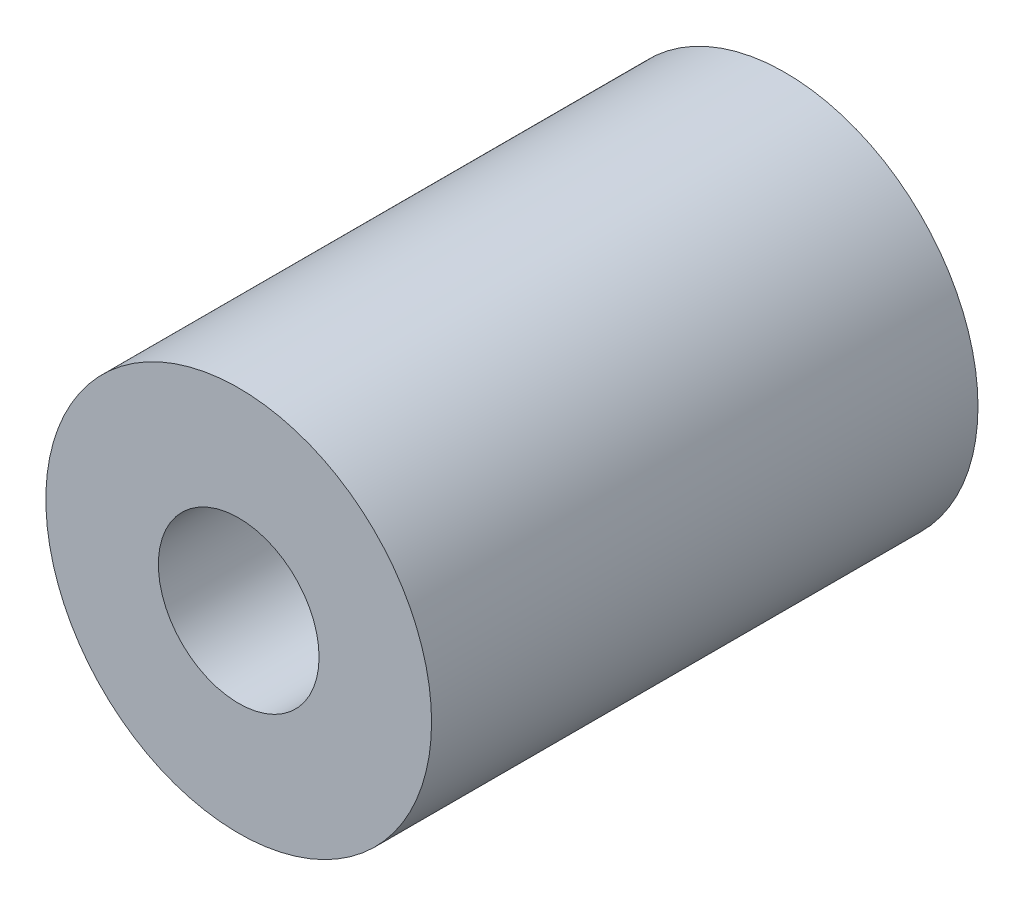
ISO-10303-21;
HEADER;
FILE_DESCRIPTION(('STEP AP214'),'2;1');
FILE_NAME('part.step','',(''),(''),'','','');
FILE_SCHEMA(('AUTOMOTIVE_DESIGN { 1 0 10303 214 1 1 1 1 }'));
ENDSEC;
DATA;
#1=APPLICATION_CONTEXT('core data for automotive mechanical design processes');
#2=APPLICATION_PROTOCOL_DEFINITION('international standard','automotive_design',2000,#1);
#3=PRODUCT_CONTEXT('',#1,'mechanical');
#4=PRODUCT('Part','Part','',(#3));
#5=PRODUCT_RELATED_PRODUCT_CATEGORY('part','',(#4));
#6=PRODUCT_DEFINITION_FORMATION('','',#4);
#7=PRODUCT_DEFINITION_CONTEXT('part definition',#1,'design');
#8=PRODUCT_DEFINITION('design','',#6,#7);
#9=PRODUCT_DEFINITION_SHAPE('','',#8);
#10=(LENGTH_UNIT() NAMED_UNIT(*) SI_UNIT(.MILLI.,.METRE.));
#11=(NAMED_UNIT(*) PLANE_ANGLE_UNIT() SI_UNIT($,.RADIAN.));
#12=(NAMED_UNIT(*) SI_UNIT($,.STERADIAN.) SOLID_ANGLE_UNIT());
#13=UNCERTAINTY_MEASURE_WITH_UNIT(LENGTH_MEASURE(1.E-05),#10,'distance_accuracy_value','');
#14=(GEOMETRIC_REPRESENTATION_CONTEXT(3) GLOBAL_UNCERTAINTY_ASSIGNED_CONTEXT((#13)) GLOBAL_UNIT_ASSIGNED_CONTEXT((#10,
#11,#12)) REPRESENTATION_CONTEXT('',''));
#15=CARTESIAN_POINT('',(0.,0.,0.));
#16=DIRECTION('',(0.,0.,1.));
#17=DIRECTION('',(1.,0.,0.));
#18=AXIS2_PLACEMENT_3D('',#15,#16,#17);
#19=CARTESIAN_POINT('',(0.,0.,8.5));
#20=DIRECTION('',(0.,0.,1.));
#21=DIRECTION('',(1.,0.,0.));
#22=AXIS2_PLACEMENT_3D('',#19,#20,#21);
#23=PLANE('',#22);
#24=CARTESIAN_POINT('',(0.,0.,8.5));
#25=DIRECTION('',(0.,0.,1.));
#26=DIRECTION('',(1.,0.,0.));
#27=AXIS2_PLACEMENT_3D('',#24,#25,#26);
#28=CIRCLE('',#27,3.);
#29=CARTESIAN_POINT('',(3.,0.,8.5));
#30=VERTEX_POINT('',#29);
#31=EDGE_CURVE('E10',#30,#30,#28,.T.);
#32=ORIENTED_EDGE('',*,*,#31,.T.);
#33=EDGE_LOOP('',(#32));
#34=FACE_BOUND('',#33,.T.);
#35=CARTESIAN_POINT('',(0.,0.,8.5));
#36=DIRECTION('',(0.,0.,1.));
#37=DIRECTION('',(1.,0.,0.));
#38=AXIS2_PLACEMENT_3D('',#35,#36,#37);
#39=CIRCLE('',#38,1.25);
#40=CARTESIAN_POINT('',(1.25,0.,8.5));
#41=VERTEX_POINT('',#40);
#42=EDGE_CURVE('E41',#41,#41,#39,.T.);
#43=ORIENTED_EDGE('',*,*,#42,.F.);
#44=EDGE_LOOP('',(#43));
#45=FACE_BOUND('',#44,.T.);
#46=ADVANCED_FACE('F30',(#34,#45),#23,.T.);
#47=CARTESIAN_POINT('',(0.,0.,0.));
#48=DIRECTION('',(0.,0.,1.));
#49=DIRECTION('',(1.,0.,0.));
#50=AXIS2_PLACEMENT_3D('',#47,#48,#49);
#51=PLANE('',#50);
#52=CARTESIAN_POINT('',(0.,0.,0.));
#53=DIRECTION('',(0.,0.,1.));
#54=DIRECTION('',(1.,0.,0.));
#55=AXIS2_PLACEMENT_3D('',#52,#53,#54);
#56=CIRCLE('',#55,3.);
#57=CARTESIAN_POINT('',(3.,0.,0.));
#58=VERTEX_POINT('',#57);
#59=EDGE_CURVE('E34',#58,#58,#56,.T.);
#60=ORIENTED_EDGE('',*,*,#59,.F.);
#61=EDGE_LOOP('',(#60));
#62=FACE_BOUND('',#61,.T.);
#63=CARTESIAN_POINT('',(0.,0.,0.));
#64=DIRECTION('',(0.,0.,1.));
#65=DIRECTION('',(1.,0.,0.));
#66=AXIS2_PLACEMENT_3D('',#63,#64,#65);
#67=CIRCLE('',#66,1.25);
#68=CARTESIAN_POINT('',(1.25,0.,0.));
#69=VERTEX_POINT('',#68);
#70=EDGE_CURVE('E43',#69,#69,#67,.T.);
#71=ORIENTED_EDGE('',*,*,#70,.T.);
#72=EDGE_LOOP('',(#71));
#73=FACE_BOUND('',#72,.T.);
#74=ADVANCED_FACE('F53',(#62,#73),#51,.F.);
#75=CARTESIAN_POINT('',(0.,0.,8.5));
#76=DIRECTION('',(0.,0.,-1.));
#77=DIRECTION('',(-1.,0.,0.));
#78=AXIS2_PLACEMENT_3D('',#75,#76,#77);
#79=CYLINDRICAL_SURFACE('',#78,3.);
#80=ORIENTED_EDGE('',*,*,#31,.F.);
#81=EDGE_LOOP('',(#80));
#82=FACE_BOUND('',#81,.T.);
#83=ORIENTED_EDGE('',*,*,#59,.T.);
#84=EDGE_LOOP('',(#83));
#85=FACE_BOUND('',#84,.T.);
#86=ADVANCED_FACE('F32',(#82,#85),#79,.T.);
#87=CARTESIAN_POINT('',(0.,0.,8.5));
#88=DIRECTION('',(0.,0.,-1.));
#89=DIRECTION('',(-1.,0.,0.));
#90=AXIS2_PLACEMENT_3D('',#87,#88,#89);
#91=CYLINDRICAL_SURFACE('',#90,1.25);
#92=ORIENTED_EDGE('',*,*,#42,.T.);
#93=EDGE_LOOP('',(#92));
#94=FACE_BOUND('',#93,.T.);
#95=ORIENTED_EDGE('',*,*,#70,.F.);
#96=EDGE_LOOP('',(#95));
#97=FACE_BOUND('',#96,.T.);
#98=ADVANCED_FACE('F49',(#94,#97),#91,.F.);
#99=CLOSED_SHELL('',(#46,#74,#86,#98));
#100=MANIFOLD_SOLID_BREP('B2',#99);
#101=ADVANCED_BREP_SHAPE_REPRESENTATION('',(#18,#100),#14);
#102=SHAPE_DEFINITION_REPRESENTATION(#9,#101);
ENDSEC;
END-ISO-10303-21;
